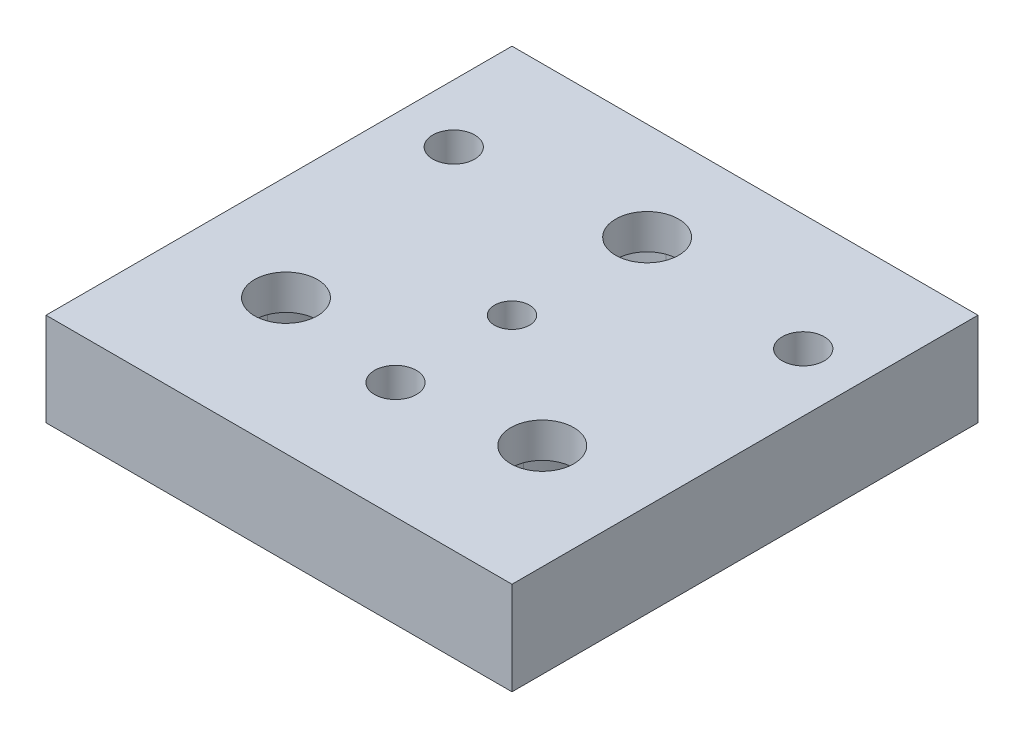
ISO-10303-21;
HEADER;
FILE_DESCRIPTION(('STEP AP214'),'2;1');
FILE_NAME('part.step','',(''),(''),'','','');
FILE_SCHEMA(('AUTOMOTIVE_DESIGN { 1 0 10303 214 1 1 1 1 }'));
ENDSEC;
DATA;
#1=APPLICATION_CONTEXT('core data for automotive mechanical design processes');
#2=APPLICATION_PROTOCOL_DEFINITION('international standard','automotive_design',2000,#1);
#3=PRODUCT_CONTEXT('',#1,'mechanical');
#4=PRODUCT('Part','Part','',(#3));
#5=PRODUCT_RELATED_PRODUCT_CATEGORY('part','',(#4));
#6=PRODUCT_DEFINITION_FORMATION('','',#4);
#7=PRODUCT_DEFINITION_CONTEXT('part definition',#1,'design');
#8=PRODUCT_DEFINITION('design','',#6,#7);
#9=PRODUCT_DEFINITION_SHAPE('','',#8);
#10=(LENGTH_UNIT() NAMED_UNIT(*) SI_UNIT(.MILLI.,.METRE.));
#11=(NAMED_UNIT(*) PLANE_ANGLE_UNIT() SI_UNIT($,.RADIAN.));
#12=(NAMED_UNIT(*) SI_UNIT($,.STERADIAN.) SOLID_ANGLE_UNIT());
#13=UNCERTAINTY_MEASURE_WITH_UNIT(LENGTH_MEASURE(1.E-05),#10,'distance_accuracy_value','');
#14=(GEOMETRIC_REPRESENTATION_CONTEXT(3) GLOBAL_UNCERTAINTY_ASSIGNED_CONTEXT((#13)) GLOBAL_UNIT_ASSIGNED_CONTEXT((#10,
#11,#12)) REPRESENTATION_CONTEXT('',''));
#15=CARTESIAN_POINT('',(0.,0.,0.));
#16=DIRECTION('',(0.,0.,1.));
#17=DIRECTION('',(1.,0.,0.));
#18=AXIS2_PLACEMENT_3D('',#15,#16,#17);
#19=CARTESIAN_POINT('',(25.4,10.16,-25.4));
#20=DIRECTION('',(-1.,0.,0.));
#21=DIRECTION('',(0.,0.,1.));
#22=AXIS2_PLACEMENT_3D('',#19,#20,#21);
#23=PLANE('',#22);
#24=DIRECTION('',(0.,0.,-1.));
#25=VECTOR('',#24,1.);
#26=CARTESIAN_POINT('',(25.4,0.,-25.4));
#27=LINE('',#26,#25);
#28=CARTESIAN_POINT('',(25.4,0.,25.4));
#29=VERTEX_POINT('',#28);
#30=CARTESIAN_POINT('',(25.4,0.,-25.4));
#31=VERTEX_POINT('',#30);
#32=EDGE_CURVE('E264',#29,#31,#27,.T.);
#33=ORIENTED_EDGE('',*,*,#32,.T.);
#34=DIRECTION('',(0.,-1.,0.));
#35=VECTOR('',#34,1.);
#36=CARTESIAN_POINT('',(25.4,10.16,-25.4));
#37=LINE('',#36,#35);
#38=CARTESIAN_POINT('',(25.4,10.16,-25.4));
#39=VERTEX_POINT('',#38);
#40=EDGE_CURVE('E11',#39,#31,#37,.T.);
#41=ORIENTED_EDGE('',*,*,#40,.F.);
#42=DIRECTION('',(0.,0.,-1.));
#43=VECTOR('',#42,1.);
#44=CARTESIAN_POINT('',(25.4,10.16,-25.4));
#45=LINE('',#44,#43);
#46=CARTESIAN_POINT('',(25.4,10.16,25.4));
#47=VERTEX_POINT('',#46);
#48=EDGE_CURVE('E267',#47,#39,#45,.T.);
#49=ORIENTED_EDGE('',*,*,#48,.F.);
#50=DIRECTION('',(0.,-1.,0.));
#51=VECTOR('',#50,1.);
#52=CARTESIAN_POINT('',(25.4,10.16,25.4));
#53=LINE('',#52,#51);
#54=EDGE_CURVE('E277',#47,#29,#53,.T.);
#55=ORIENTED_EDGE('',*,*,#54,.T.);
#56=EDGE_LOOP('',(#33,#41,#49,#55));
#57=FACE_BOUND('',#56,.T.);
#58=ADVANCED_FACE('F33',(#57),#23,.F.);
#59=CARTESIAN_POINT('',(-25.4,10.16,-25.4));
#60=DIRECTION('',(0.,0.,1.));
#61=DIRECTION('',(1.,0.,0.));
#62=AXIS2_PLACEMENT_3D('',#59,#60,#61);
#63=PLANE('',#62);
#64=DIRECTION('',(-1.,0.,0.));
#65=VECTOR('',#64,1.);
#66=CARTESIAN_POINT('',(-25.4,0.,-25.4));
#67=LINE('',#66,#65);
#68=CARTESIAN_POINT('',(-25.4,0.,-25.4));
#69=VERTEX_POINT('',#68);
#70=EDGE_CURVE('E280',#31,#69,#67,.T.);
#71=ORIENTED_EDGE('',*,*,#70,.T.);
#72=DIRECTION('',(0.,-1.,0.));
#73=VECTOR('',#72,1.);
#74=CARTESIAN_POINT('',(-25.4,10.16,-25.4));
#75=LINE('',#74,#73);
#76=CARTESIAN_POINT('',(-25.4,10.16,-25.4));
#77=VERTEX_POINT('',#76);
#78=EDGE_CURVE('E40',#77,#69,#75,.T.);
#79=ORIENTED_EDGE('',*,*,#78,.F.);
#80=DIRECTION('',(-1.,0.,0.));
#81=VECTOR('',#80,1.);
#82=CARTESIAN_POINT('',(-25.4,10.16,-25.4));
#83=LINE('',#82,#81);
#84=EDGE_CURVE('E270',#39,#77,#83,.T.);
#85=ORIENTED_EDGE('',*,*,#84,.F.);
#86=ORIENTED_EDGE('',*,*,#40,.T.);
#87=EDGE_LOOP('',(#71,#79,#85,#86));
#88=FACE_BOUND('',#87,.T.);
#89=ADVANCED_FACE('F310',(#88),#63,.F.);
#90=CARTESIAN_POINT('',(-25.4,10.16,-25.4));
#91=DIRECTION('',(1.,0.,0.));
#92=DIRECTION('',(0.,0.,-1.));
#93=AXIS2_PLACEMENT_3D('',#90,#91,#92);
#94=PLANE('',#93);
#95=DIRECTION('',(0.,0.,1.));
#96=VECTOR('',#95,1.);
#97=CARTESIAN_POINT('',(-25.4,0.,-25.4));
#98=LINE('',#97,#96);
#99=CARTESIAN_POINT('',(-25.4,0.,25.4));
#100=VERTEX_POINT('',#99);
#101=EDGE_CURVE('E282',#69,#100,#98,.T.);
#102=ORIENTED_EDGE('',*,*,#101,.T.);
#103=DIRECTION('',(0.,-1.,0.));
#104=VECTOR('',#103,1.);
#105=CARTESIAN_POINT('',(-25.4,10.16,25.4));
#106=LINE('',#105,#104);
#107=CARTESIAN_POINT('',(-25.4,10.16,25.4));
#108=VERTEX_POINT('',#107);
#109=EDGE_CURVE('E287',#108,#100,#106,.T.);
#110=ORIENTED_EDGE('',*,*,#109,.F.);
#111=DIRECTION('',(0.,0.,1.));
#112=VECTOR('',#111,1.);
#113=CARTESIAN_POINT('',(-25.4,10.16,-25.4));
#114=LINE('',#113,#112);
#115=EDGE_CURVE('E273',#77,#108,#114,.T.);
#116=ORIENTED_EDGE('',*,*,#115,.F.);
#117=ORIENTED_EDGE('',*,*,#78,.T.);
#118=EDGE_LOOP('',(#102,#110,#116,#117));
#119=FACE_BOUND('',#118,.T.);
#120=ADVANCED_FACE('F294',(#119),#94,.F.);
#121=CARTESIAN_POINT('',(-25.4,10.16,25.4));
#122=DIRECTION('',(0.,0.,-1.));
#123=DIRECTION('',(-1.,0.,0.));
#124=AXIS2_PLACEMENT_3D('',#121,#122,#123);
#125=PLANE('',#124);
#126=DIRECTION('',(1.,0.,0.));
#127=VECTOR('',#126,1.);
#128=CARTESIAN_POINT('',(-25.4,0.,25.4));
#129=LINE('',#128,#127);
#130=EDGE_CURVE('E271',#100,#29,#129,.T.);
#131=ORIENTED_EDGE('',*,*,#130,.T.);
#132=ORIENTED_EDGE('',*,*,#54,.F.);
#133=DIRECTION('',(1.,0.,0.));
#134=VECTOR('',#133,1.);
#135=CARTESIAN_POINT('',(-25.4,10.16,25.4));
#136=LINE('',#135,#134);
#137=EDGE_CURVE('E275',#108,#47,#136,.T.);
#138=ORIENTED_EDGE('',*,*,#137,.F.);
#139=ORIENTED_EDGE('',*,*,#109,.T.);
#140=EDGE_LOOP('',(#131,#132,#138,#139));
#141=FACE_BOUND('',#140,.T.);
#142=ADVANCED_FACE('F303',(#141),#125,.F.);
#143=CARTESIAN_POINT('',(0.,10.16,0.));
#144=DIRECTION('',(0.,1.,0.));
#145=DIRECTION('',(0.,0.,1.));
#146=AXIS2_PLACEMENT_3D('',#143,#144,#145);
#147=PLANE('',#146);
#148=CARTESIAN_POINT('',(0.,10.16,0.));
#149=DIRECTION('',(0.,1.,0.));
#150=DIRECTION('',(0.,0.,1.));
#151=AXIS2_PLACEMENT_3D('',#148,#149,#150);
#152=CIRCLE('',#151,1.905);
#153=CARTESIAN_POINT('',(0.,10.16,1.905));
#154=VERTEX_POINT('',#153);
#155=EDGE_CURVE('E415',#154,#154,#152,.T.);
#156=ORIENTED_EDGE('',*,*,#155,.F.);
#157=EDGE_LOOP('',(#156));
#158=FACE_BOUND('',#157,.T.);
#159=CARTESIAN_POINT('',(0.,10.16,-14.732));
#160=DIRECTION('',(0.,-1.,0.));
#161=DIRECTION('',(0.,0.,-1.));
#162=AXIS2_PLACEMENT_3D('',#159,#160,#161);
#163=CIRCLE('',#162,3.429);
#164=CARTESIAN_POINT('',(0.,10.16,-18.161));
#165=VERTEX_POINT('',#164);
#166=EDGE_CURVE('E417',#165,#165,#163,.T.);
#167=ORIENTED_EDGE('',*,*,#166,.T.);
#168=EDGE_LOOP('',(#167));
#169=FACE_BOUND('',#168,.T.);
#170=CARTESIAN_POINT('',(13.97,10.16,10.668));
#171=DIRECTION('',(0.,-1.,0.));
#172=DIRECTION('',(0.,0.,-1.));
#173=AXIS2_PLACEMENT_3D('',#170,#171,#172);
#174=CIRCLE('',#173,3.429);
#175=CARTESIAN_POINT('',(13.97,10.16,7.23899999999999));
#176=VERTEX_POINT('',#175);
#177=EDGE_CURVE('E425',#176,#176,#174,.T.);
#178=ORIENTED_EDGE('',*,*,#177,.T.);
#179=EDGE_LOOP('',(#178));
#180=FACE_BOUND('',#179,.T.);
#181=CARTESIAN_POINT('',(-13.97,10.16,10.668));
#182=DIRECTION('',(0.,-1.,0.));
#183=DIRECTION('',(0.,0.,-1.));
#184=AXIS2_PLACEMENT_3D('',#181,#182,#183);
#185=CIRCLE('',#184,3.429);
#186=CARTESIAN_POINT('',(-13.97,10.16,7.239));
#187=VERTEX_POINT('',#186);
#188=EDGE_CURVE('E430',#187,#187,#185,.T.);
#189=ORIENTED_EDGE('',*,*,#188,.T.);
#190=EDGE_LOOP('',(#189));
#191=FACE_BOUND('',#190,.T.);
#192=CARTESIAN_POINT('',(0.,10.16,12.7));
#193=DIRECTION('',(0.,1.,0.));
#194=DIRECTION('',(0.,0.,1.));
#195=AXIS2_PLACEMENT_3D('',#192,#193,#194);
#196=CIRCLE('',#195,2.286);
#197=CARTESIAN_POINT('',(0.,10.16,14.986));
#198=VERTEX_POINT('',#197);
#199=EDGE_CURVE('E242',#198,#198,#196,.T.);
#200=ORIENTED_EDGE('',*,*,#199,.F.);
#201=EDGE_LOOP('',(#200));
#202=FACE_BOUND('',#201,.T.);
#203=CARTESIAN_POINT('',(19.05,10.16,-12.7));
#204=DIRECTION('',(0.,1.,0.));
#205=DIRECTION('',(0.,0.,1.));
#206=AXIS2_PLACEMENT_3D('',#203,#204,#205);
#207=CIRCLE('',#206,2.286);
#208=CARTESIAN_POINT('',(19.05,10.16,-10.414));
#209=VERTEX_POINT('',#208);
#210=EDGE_CURVE('E252',#209,#209,#207,.T.);
#211=ORIENTED_EDGE('',*,*,#210,.F.);
#212=EDGE_LOOP('',(#211));
#213=FACE_BOUND('',#212,.T.);
#214=CARTESIAN_POINT('',(-19.05,10.16,-12.7));
#215=DIRECTION('',(0.,1.,0.));
#216=DIRECTION('',(0.,0.,1.));
#217=AXIS2_PLACEMENT_3D('',#214,#215,#216);
#218=CIRCLE('',#217,2.286);
#219=CARTESIAN_POINT('',(-19.05,10.16,-10.414));
#220=VERTEX_POINT('',#219);
#221=EDGE_CURVE('E258',#220,#220,#218,.T.);
#222=ORIENTED_EDGE('',*,*,#221,.F.);
#223=EDGE_LOOP('',(#222));
#224=FACE_BOUND('',#223,.T.);
#225=ORIENTED_EDGE('',*,*,#48,.T.);
#226=ORIENTED_EDGE('',*,*,#84,.T.);
#227=ORIENTED_EDGE('',*,*,#115,.T.);
#228=ORIENTED_EDGE('',*,*,#137,.T.);
#229=EDGE_LOOP('',(#225,#226,#227,#228));
#230=FACE_BOUND('',#229,.T.);
#231=ADVANCED_FACE('F309',(#158,#169,#180,#191,#202,#213,#224,#230),#147,.T.);
#232=CARTESIAN_POINT('',(0.,0.,0.));
#233=DIRECTION('',(0.,1.,0.));
#234=DIRECTION('',(0.,0.,1.));
#235=AXIS2_PLACEMENT_3D('',#232,#233,#234);
#236=PLANE('',#235);
#237=CARTESIAN_POINT('',(0.,0.,0.));
#238=DIRECTION('',(0.,1.,0.));
#239=DIRECTION('',(0.,0.,1.));
#240=AXIS2_PLACEMENT_3D('',#237,#238,#239);
#241=CIRCLE('',#240,1.905);
#242=CARTESIAN_POINT('',(0.,0.,1.905));
#243=VERTEX_POINT('',#242);
#244=EDGE_CURVE('E412',#243,#243,#241,.T.);
#245=ORIENTED_EDGE('',*,*,#244,.T.);
#246=EDGE_LOOP('',(#245));
#247=FACE_BOUND('',#246,.T.);
#248=DIRECTION('',(1.,0.,0.));
#249=VECTOR('',#248,1.);
#250=CARTESIAN_POINT('',(-5.58800000000001,0.,-22.352));
#251=LINE('',#250,#249);
#252=CARTESIAN_POINT('',(-5.58800000000001,0.,-22.352));
#253=VERTEX_POINT('',#252);
#254=CARTESIAN_POINT('',(5.588,0.,-22.352));
#255=VERTEX_POINT('',#254);
#256=EDGE_CURVE('E177',#253,#255,#251,.T.);
#257=ORIENTED_EDGE('',*,*,#256,.F.);
#258=CARTESIAN_POINT('',(-5.58800000000001,0.,-14.732));
#259=DIRECTION('',(0.,-1.,0.));
#260=DIRECTION('',(0.,0.,-1.));
#261=AXIS2_PLACEMENT_3D('',#258,#259,#260);
#262=CIRCLE('',#261,7.62);
#263=CARTESIAN_POINT('',(-5.58800000000001,0.,-7.112));
#264=VERTEX_POINT('',#263);
#265=EDGE_CURVE('E47',#264,#253,#262,.T.);
#266=ORIENTED_EDGE('',*,*,#265,.F.);
#267=DIRECTION('',(-1.,0.,0.));
#268=VECTOR('',#267,1.);
#269=CARTESIAN_POINT('',(-5.58800000000001,0.,-7.112));
#270=LINE('',#269,#268);
#271=CARTESIAN_POINT('',(5.58799999999999,0.,-7.112));
#272=VERTEX_POINT('',#271);
#273=EDGE_CURVE('E165',#272,#264,#270,.T.);
#274=ORIENTED_EDGE('',*,*,#273,.F.);
#275=CARTESIAN_POINT('',(5.58799999999999,0.,-14.732));
#276=DIRECTION('',(0.,-1.,0.));
#277=DIRECTION('',(0.,0.,-1.));
#278=AXIS2_PLACEMENT_3D('',#275,#276,#277);
#279=CIRCLE('',#278,7.62);
#280=EDGE_CURVE('E168',#255,#272,#279,.T.);
#281=ORIENTED_EDGE('',*,*,#280,.F.);
#282=EDGE_LOOP('',(#257,#266,#274,#281));
#283=FACE_BOUND('',#282,.T.);
#284=DIRECTION('',(0.,0.,-1.));
#285=VECTOR('',#284,1.);
#286=CARTESIAN_POINT('',(6.34999999999999,0.,16.256));
#287=LINE('',#286,#285);
#288=CARTESIAN_POINT('',(6.34999999999999,0.,16.256));
#289=VERTEX_POINT('',#288);
#290=CARTESIAN_POINT('',(6.34999999999999,0.,5.08));
#291=VERTEX_POINT('',#290);
#292=EDGE_CURVE('E201',#289,#291,#287,.T.);
#293=ORIENTED_EDGE('',*,*,#292,.F.);
#294=CARTESIAN_POINT('',(13.97,0.,16.256));
#295=DIRECTION('',(0.,-1.,0.));
#296=DIRECTION('',(0.,0.,-1.));
#297=AXIS2_PLACEMENT_3D('',#294,#295,#296);
#298=CIRCLE('',#297,7.62);
#299=CARTESIAN_POINT('',(21.59,0.,16.256));
#300=VERTEX_POINT('',#299);
#301=EDGE_CURVE('E55',#300,#289,#298,.T.);
#302=ORIENTED_EDGE('',*,*,#301,.F.);
#303=DIRECTION('',(0.,0.,1.));
#304=VECTOR('',#303,1.);
#305=CARTESIAN_POINT('',(21.59,0.,16.256));
#306=LINE('',#305,#304);
#307=CARTESIAN_POINT('',(21.59,0.,5.08));
#308=VERTEX_POINT('',#307);
#309=EDGE_CURVE('E190',#308,#300,#306,.T.);
#310=ORIENTED_EDGE('',*,*,#309,.F.);
#311=CARTESIAN_POINT('',(13.97,0.,5.08));
#312=DIRECTION('',(0.,-1.,0.));
#313=DIRECTION('',(0.,0.,-1.));
#314=AXIS2_PLACEMENT_3D('',#311,#312,#313);
#315=CIRCLE('',#314,7.62);
#316=EDGE_CURVE('E204',#291,#308,#315,.T.);
#317=ORIENTED_EDGE('',*,*,#316,.F.);
#318=EDGE_LOOP('',(#293,#302,#310,#317));
#319=FACE_BOUND('',#318,.T.);
#320=DIRECTION('',(0.,0.,-1.));
#321=VECTOR('',#320,1.);
#322=CARTESIAN_POINT('',(-21.59,0.,16.256));
#323=LINE('',#322,#321);
#324=CARTESIAN_POINT('',(-21.59,0.,16.256));
#325=VERTEX_POINT('',#324);
#326=CARTESIAN_POINT('',(-21.59,0.,5.08));
#327=VERTEX_POINT('',#326);
#328=EDGE_CURVE('E232',#325,#327,#323,.T.);
#329=ORIENTED_EDGE('',*,*,#328,.F.);
#330=CARTESIAN_POINT('',(-13.97,0.,16.256));
#331=DIRECTION('',(0.,-1.,0.));
#332=DIRECTION('',(0.,0.,-1.));
#333=AXIS2_PLACEMENT_3D('',#330,#331,#332);
#334=CIRCLE('',#333,7.62);
#335=CARTESIAN_POINT('',(-6.35000000000004,0.,16.256));
#336=VERTEX_POINT('',#335);
#337=EDGE_CURVE('E211',#336,#325,#334,.T.);
#338=ORIENTED_EDGE('',*,*,#337,.F.);
#339=DIRECTION('',(0.,0.,1.));
#340=VECTOR('',#339,1.);
#341=CARTESIAN_POINT('',(-6.35000000000004,0.,16.256));
#342=LINE('',#341,#340);
#343=CARTESIAN_POINT('',(-6.35000000000003,0.,5.08));
#344=VERTEX_POINT('',#343);
#345=EDGE_CURVE('E221',#344,#336,#342,.T.);
#346=ORIENTED_EDGE('',*,*,#345,.F.);
#347=CARTESIAN_POINT('',(-13.97,0.,5.08));
#348=DIRECTION('',(0.,-1.,0.));
#349=DIRECTION('',(0.,0.,-1.));
#350=AXIS2_PLACEMENT_3D('',#347,#348,#349);
#351=CIRCLE('',#350,7.62);
#352=EDGE_CURVE('E235',#327,#344,#351,.T.);
#353=ORIENTED_EDGE('',*,*,#352,.F.);
#354=EDGE_LOOP('',(#329,#338,#346,#353));
#355=FACE_BOUND('',#354,.T.);
#356=CARTESIAN_POINT('',(0.,0.,12.7));
#357=DIRECTION('',(0.,1.,0.));
#358=DIRECTION('',(0.,0.,1.));
#359=AXIS2_PLACEMENT_3D('',#356,#357,#358);
#360=CIRCLE('',#359,2.286);
#361=CARTESIAN_POINT('',(0.,0.,14.986));
#362=VERTEX_POINT('',#361);
#363=EDGE_CURVE('E249',#362,#362,#360,.T.);
#364=ORIENTED_EDGE('',*,*,#363,.T.);
#365=EDGE_LOOP('',(#364));
#366=FACE_BOUND('',#365,.T.);
#367=CARTESIAN_POINT('',(19.05,0.,-12.7));
#368=DIRECTION('',(0.,1.,0.));
#369=DIRECTION('',(0.,0.,1.));
#370=AXIS2_PLACEMENT_3D('',#367,#368,#369);
#371=CIRCLE('',#370,2.286);
#372=CARTESIAN_POINT('',(19.05,0.,-10.414));
#373=VERTEX_POINT('',#372);
#374=EDGE_CURVE('E255',#373,#373,#371,.T.);
#375=ORIENTED_EDGE('',*,*,#374,.T.);
#376=EDGE_LOOP('',(#375));
#377=FACE_BOUND('',#376,.T.);
#378=CARTESIAN_POINT('',(-19.05,0.,-12.7));
#379=DIRECTION('',(0.,1.,0.));
#380=DIRECTION('',(0.,0.,1.));
#381=AXIS2_PLACEMENT_3D('',#378,#379,#380);
#382=CIRCLE('',#381,2.286);
#383=CARTESIAN_POINT('',(-19.05,0.,-10.414));
#384=VERTEX_POINT('',#383);
#385=EDGE_CURVE('E261',#384,#384,#382,.T.);
#386=ORIENTED_EDGE('',*,*,#385,.T.);
#387=EDGE_LOOP('',(#386));
#388=FACE_BOUND('',#387,.T.);
#389=ORIENTED_EDGE('',*,*,#32,.F.);
#390=ORIENTED_EDGE('',*,*,#130,.F.);
#391=ORIENTED_EDGE('',*,*,#101,.F.);
#392=ORIENTED_EDGE('',*,*,#70,.F.);
#393=EDGE_LOOP('',(#389,#390,#391,#392));
#394=FACE_BOUND('',#393,.T.);
#395=ADVANCED_FACE('F300',(#247,#283,#319,#355,#366,#377,#388,#394),#236,.F.);
#396=CARTESIAN_POINT('',(-19.05,0.,-12.7));
#397=DIRECTION('',(0.,1.,0.));
#398=DIRECTION('',(0.,0.,1.));
#399=AXIS2_PLACEMENT_3D('',#396,#397,#398);
#400=CYLINDRICAL_SURFACE('',#399,2.286);
#401=ORIENTED_EDGE('',*,*,#385,.F.);
#402=EDGE_LOOP('',(#401));
#403=FACE_BOUND('',#402,.T.);
#404=ORIENTED_EDGE('',*,*,#221,.T.);
#405=EDGE_LOOP('',(#404));
#406=FACE_BOUND('',#405,.T.);
#407=ADVANCED_FACE('F322',(#403,#406),#400,.F.);
#408=CARTESIAN_POINT('',(19.05,0.,-12.7));
#409=DIRECTION('',(0.,1.,0.));
#410=DIRECTION('',(0.,0.,1.));
#411=AXIS2_PLACEMENT_3D('',#408,#409,#410);
#412=CYLINDRICAL_SURFACE('',#411,2.286);
#413=ORIENTED_EDGE('',*,*,#374,.F.);
#414=EDGE_LOOP('',(#413));
#415=FACE_BOUND('',#414,.T.);
#416=ORIENTED_EDGE('',*,*,#210,.T.);
#417=EDGE_LOOP('',(#416));
#418=FACE_BOUND('',#417,.T.);
#419=ADVANCED_FACE('F329',(#415,#418),#412,.F.);
#420=CARTESIAN_POINT('',(0.,0.,12.7));
#421=DIRECTION('',(0.,1.,0.));
#422=DIRECTION('',(0.,0.,1.));
#423=AXIS2_PLACEMENT_3D('',#420,#421,#422);
#424=CYLINDRICAL_SURFACE('',#423,2.286);
#425=ORIENTED_EDGE('',*,*,#363,.F.);
#426=EDGE_LOOP('',(#425));
#427=FACE_BOUND('',#426,.T.);
#428=ORIENTED_EDGE('',*,*,#199,.T.);
#429=EDGE_LOOP('',(#428));
#430=FACE_BOUND('',#429,.T.);
#431=ADVANCED_FACE('F333',(#427,#430),#424,.F.);
#432=CARTESIAN_POINT('',(-13.97,6.35,16.256));
#433=DIRECTION('',(0.,-1.,0.));
#434=DIRECTION('',(0.,0.,-1.));
#435=AXIS2_PLACEMENT_3D('',#432,#433,#434);
#436=CYLINDRICAL_SURFACE('',#435,7.62);
#437=ORIENTED_EDGE('',*,*,#337,.T.);
#438=DIRECTION('',(0.,-1.,0.));
#439=VECTOR('',#438,1.);
#440=CARTESIAN_POINT('',(-21.59,6.35,16.256));
#441=LINE('',#440,#439);
#442=CARTESIAN_POINT('',(-21.59,6.35,16.256));
#443=VERTEX_POINT('',#442);
#444=EDGE_CURVE('E230',#443,#325,#441,.T.);
#445=ORIENTED_EDGE('',*,*,#444,.F.);
#446=CARTESIAN_POINT('',(-13.97,6.35,16.256));
#447=DIRECTION('',(0.,-1.,0.));
#448=DIRECTION('',(0.,0.,-1.));
#449=AXIS2_PLACEMENT_3D('',#446,#447,#448);
#450=CIRCLE('',#449,7.62);
#451=CARTESIAN_POINT('',(-6.35000000000004,6.35,16.256));
#452=VERTEX_POINT('',#451);
#453=EDGE_CURVE('E217',#452,#443,#450,.T.);
#454=ORIENTED_EDGE('',*,*,#453,.F.);
#455=DIRECTION('',(0.,-1.,0.));
#456=VECTOR('',#455,1.);
#457=CARTESIAN_POINT('',(-6.35000000000004,6.35,16.256));
#458=LINE('',#457,#456);
#459=EDGE_CURVE('E240',#452,#336,#458,.T.);
#460=ORIENTED_EDGE('',*,*,#459,.T.);
#461=EDGE_LOOP('',(#437,#445,#454,#460));
#462=FACE_BOUND('',#461,.T.);
#463=ADVANCED_FACE('F337',(#462),#436,.F.);
#464=CARTESIAN_POINT('',(-6.35000000000004,6.35,16.256));
#465=DIRECTION('',(1.,0.,0.));
#466=DIRECTION('',(0.,0.,-1.));
#467=AXIS2_PLACEMENT_3D('',#464,#465,#466);
#468=PLANE('',#467);
#469=ORIENTED_EDGE('',*,*,#345,.T.);
#470=ORIENTED_EDGE('',*,*,#459,.F.);
#471=DIRECTION('',(0.,0.,1.));
#472=VECTOR('',#471,1.);
#473=CARTESIAN_POINT('',(-6.35000000000004,6.35,16.256));
#474=LINE('',#473,#472);
#475=CARTESIAN_POINT('',(-6.35000000000003,6.35,5.08));
#476=VERTEX_POINT('',#475);
#477=EDGE_CURVE('E227',#476,#452,#474,.T.);
#478=ORIENTED_EDGE('',*,*,#477,.F.);
#479=DIRECTION('',(0.,-1.,0.));
#480=VECTOR('',#479,1.);
#481=CARTESIAN_POINT('',(-6.35000000000003,6.35,5.08));
#482=LINE('',#481,#480);
#483=EDGE_CURVE('E243',#476,#344,#482,.T.);
#484=ORIENTED_EDGE('',*,*,#483,.T.);
#485=EDGE_LOOP('',(#469,#470,#478,#484));
#486=FACE_BOUND('',#485,.T.);
#487=ADVANCED_FACE('F341',(#486),#468,.F.);
#488=CARTESIAN_POINT('',(-13.97,6.35,5.08));
#489=DIRECTION('',(0.,-1.,0.));
#490=DIRECTION('',(0.,0.,-1.));
#491=AXIS2_PLACEMENT_3D('',#488,#489,#490);
#492=CYLINDRICAL_SURFACE('',#491,7.62);
#493=ORIENTED_EDGE('',*,*,#352,.T.);
#494=ORIENTED_EDGE('',*,*,#483,.F.);
#495=CARTESIAN_POINT('',(-13.97,6.35,5.08));
#496=DIRECTION('',(0.,-1.,0.));
#497=DIRECTION('',(0.,0.,-1.));
#498=AXIS2_PLACEMENT_3D('',#495,#496,#497);
#499=CIRCLE('',#498,7.62);
#500=CARTESIAN_POINT('',(-21.59,6.35,5.08));
#501=VERTEX_POINT('',#500);
#502=EDGE_CURVE('E224',#501,#476,#499,.T.);
#503=ORIENTED_EDGE('',*,*,#502,.F.);
#504=DIRECTION('',(0.,-1.,0.));
#505=VECTOR('',#504,1.);
#506=CARTESIAN_POINT('',(-21.59,6.35,5.08));
#507=LINE('',#506,#505);
#508=EDGE_CURVE('E245',#501,#327,#507,.T.);
#509=ORIENTED_EDGE('',*,*,#508,.T.);
#510=EDGE_LOOP('',(#493,#494,#503,#509));
#511=FACE_BOUND('',#510,.T.);
#512=ADVANCED_FACE('F347',(#511),#492,.F.);
#513=CARTESIAN_POINT('',(-21.59,6.35,16.256));
#514=DIRECTION('',(-1.,0.,0.));
#515=DIRECTION('',(0.,0.,1.));
#516=AXIS2_PLACEMENT_3D('',#513,#514,#515);
#517=PLANE('',#516);
#518=ORIENTED_EDGE('',*,*,#328,.T.);
#519=ORIENTED_EDGE('',*,*,#508,.F.);
#520=DIRECTION('',(0.,0.,-1.));
#521=VECTOR('',#520,1.);
#522=CARTESIAN_POINT('',(-21.59,6.35,16.256));
#523=LINE('',#522,#521);
#524=EDGE_CURVE('E220',#443,#501,#523,.T.);
#525=ORIENTED_EDGE('',*,*,#524,.F.);
#526=ORIENTED_EDGE('',*,*,#444,.T.);
#527=EDGE_LOOP('',(#518,#519,#525,#526));
#528=FACE_BOUND('',#527,.T.);
#529=ADVANCED_FACE('F343',(#528),#517,.F.);
#530=CARTESIAN_POINT('',(-13.97,6.35,16.256));
#531=DIRECTION('',(0.,-1.,0.));
#532=DIRECTION('',(0.,0.,-1.));
#533=AXIS2_PLACEMENT_3D('',#530,#531,#532);
#534=PLANE('',#533);
#535=CARTESIAN_POINT('',(-13.97,6.35,10.668));
#536=DIRECTION('',(0.,-1.,0.));
#537=DIRECTION('',(0.,0.,-1.));
#538=AXIS2_PLACEMENT_3D('',#535,#536,#537);
#539=CIRCLE('',#538,3.429);
#540=CARTESIAN_POINT('',(-13.97,6.35,7.239));
#541=VERTEX_POINT('',#540);
#542=EDGE_CURVE('E171',#541,#541,#539,.T.);
#543=ORIENTED_EDGE('',*,*,#542,.F.);
#544=EDGE_LOOP('',(#543));
#545=FACE_BOUND('',#544,.T.);
#546=ORIENTED_EDGE('',*,*,#453,.T.);
#547=ORIENTED_EDGE('',*,*,#524,.T.);
#548=ORIENTED_EDGE('',*,*,#502,.T.);
#549=ORIENTED_EDGE('',*,*,#477,.T.);
#550=EDGE_LOOP('',(#546,#547,#548,#549));
#551=FACE_BOUND('',#550,.T.);
#552=ADVANCED_FACE('F346',(#545,#551),#534,.T.);
#553=CARTESIAN_POINT('',(13.97,6.35,16.256));
#554=DIRECTION('',(0.,-1.,0.));
#555=DIRECTION('',(0.,0.,-1.));
#556=AXIS2_PLACEMENT_3D('',#553,#554,#555);
#557=CYLINDRICAL_SURFACE('',#556,7.62);
#558=ORIENTED_EDGE('',*,*,#301,.T.);
#559=DIRECTION('',(0.,-1.,0.));
#560=VECTOR('',#559,1.);
#561=CARTESIAN_POINT('',(6.34999999999999,6.35,16.256));
#562=LINE('',#561,#560);
#563=CARTESIAN_POINT('',(6.34999999999999,6.35,16.256));
#564=VERTEX_POINT('',#563);
#565=EDGE_CURVE('E199',#564,#289,#562,.T.);
#566=ORIENTED_EDGE('',*,*,#565,.F.);
#567=CARTESIAN_POINT('',(13.97,6.35,16.256));
#568=DIRECTION('',(0.,-1.,0.));
#569=DIRECTION('',(0.,0.,-1.));
#570=AXIS2_PLACEMENT_3D('',#567,#568,#569);
#571=CIRCLE('',#570,7.62);
#572=CARTESIAN_POINT('',(21.59,6.35,16.256));
#573=VERTEX_POINT('',#572);
#574=EDGE_CURVE('E186',#573,#564,#571,.T.);
#575=ORIENTED_EDGE('',*,*,#574,.F.);
#576=DIRECTION('',(0.,-1.,0.));
#577=VECTOR('',#576,1.);
#578=CARTESIAN_POINT('',(21.59,6.35,16.256));
#579=LINE('',#578,#577);
#580=EDGE_CURVE('E209',#573,#300,#579,.T.);
#581=ORIENTED_EDGE('',*,*,#580,.T.);
#582=EDGE_LOOP('',(#558,#566,#575,#581));
#583=FACE_BOUND('',#582,.T.);
#584=ADVANCED_FACE('F357',(#583),#557,.F.);
#585=CARTESIAN_POINT('',(21.59,6.35,16.256));
#586=DIRECTION('',(1.,0.,0.));
#587=DIRECTION('',(0.,0.,-1.));
#588=AXIS2_PLACEMENT_3D('',#585,#586,#587);
#589=PLANE('',#588);
#590=ORIENTED_EDGE('',*,*,#309,.T.);
#591=ORIENTED_EDGE('',*,*,#580,.F.);
#592=DIRECTION('',(0.,0.,1.));
#593=VECTOR('',#592,1.);
#594=CARTESIAN_POINT('',(21.59,6.35,16.256));
#595=LINE('',#594,#593);
#596=CARTESIAN_POINT('',(21.59,6.35,5.08));
#597=VERTEX_POINT('',#596);
#598=EDGE_CURVE('E196',#597,#573,#595,.T.);
#599=ORIENTED_EDGE('',*,*,#598,.F.);
#600=DIRECTION('',(0.,-1.,0.));
#601=VECTOR('',#600,1.);
#602=CARTESIAN_POINT('',(21.59,6.35,5.08));
#603=LINE('',#602,#601);
#604=EDGE_CURVE('E212',#597,#308,#603,.T.);
#605=ORIENTED_EDGE('',*,*,#604,.T.);
#606=EDGE_LOOP('',(#590,#591,#599,#605));
#607=FACE_BOUND('',#606,.T.);
#608=ADVANCED_FACE('F361',(#607),#589,.F.);
#609=CARTESIAN_POINT('',(13.97,6.35,5.08));
#610=DIRECTION('',(0.,-1.,0.));
#611=DIRECTION('',(0.,0.,-1.));
#612=AXIS2_PLACEMENT_3D('',#609,#610,#611);
#613=CYLINDRICAL_SURFACE('',#612,7.62);
#614=ORIENTED_EDGE('',*,*,#316,.T.);
#615=ORIENTED_EDGE('',*,*,#604,.F.);
#616=CARTESIAN_POINT('',(13.97,6.35,5.08));
#617=DIRECTION('',(0.,-1.,0.));
#618=DIRECTION('',(0.,0.,-1.));
#619=AXIS2_PLACEMENT_3D('',#616,#617,#618);
#620=CIRCLE('',#619,7.62);
#621=CARTESIAN_POINT('',(6.34999999999999,6.35,5.08));
#622=VERTEX_POINT('',#621);
#623=EDGE_CURVE('E193',#622,#597,#620,.T.);
#624=ORIENTED_EDGE('',*,*,#623,.F.);
#625=DIRECTION('',(0.,-1.,0.));
#626=VECTOR('',#625,1.);
#627=CARTESIAN_POINT('',(6.34999999999999,6.35,5.08));
#628=LINE('',#627,#626);
#629=EDGE_CURVE('E214',#622,#291,#628,.T.);
#630=ORIENTED_EDGE('',*,*,#629,.T.);
#631=EDGE_LOOP('',(#614,#615,#624,#630));
#632=FACE_BOUND('',#631,.T.);
#633=ADVANCED_FACE('F366',(#632),#613,.F.);
#634=CARTESIAN_POINT('',(6.34999999999999,6.35,16.256));
#635=DIRECTION('',(-1.,0.,0.));
#636=DIRECTION('',(0.,0.,1.));
#637=AXIS2_PLACEMENT_3D('',#634,#635,#636);
#638=PLANE('',#637);
#639=ORIENTED_EDGE('',*,*,#292,.T.);
#640=ORIENTED_EDGE('',*,*,#629,.F.);
#641=DIRECTION('',(0.,0.,-1.));
#642=VECTOR('',#641,1.);
#643=CARTESIAN_POINT('',(6.34999999999999,6.35,16.256));
#644=LINE('',#643,#642);
#645=EDGE_CURVE('E189',#564,#622,#644,.T.);
#646=ORIENTED_EDGE('',*,*,#645,.F.);
#647=ORIENTED_EDGE('',*,*,#565,.T.);
#648=EDGE_LOOP('',(#639,#640,#646,#647));
#649=FACE_BOUND('',#648,.T.);
#650=ADVANCED_FACE('F362',(#649),#638,.F.);
#651=CARTESIAN_POINT('',(13.97,6.35,16.256));
#652=DIRECTION('',(0.,-1.,0.));
#653=DIRECTION('',(0.,0.,-1.));
#654=AXIS2_PLACEMENT_3D('',#651,#652,#653);
#655=PLANE('',#654);
#656=CARTESIAN_POINT('',(13.97,6.35,10.668));
#657=DIRECTION('',(0.,-1.,0.));
#658=DIRECTION('',(0.,0.,-1.));
#659=AXIS2_PLACEMENT_3D('',#656,#657,#658);
#660=CIRCLE('',#659,3.429);
#661=CARTESIAN_POINT('',(13.97,6.35,7.23899999999999));
#662=VERTEX_POINT('',#661);
#663=EDGE_CURVE('E428',#662,#662,#660,.T.);
#664=ORIENTED_EDGE('',*,*,#663,.F.);
#665=EDGE_LOOP('',(#664));
#666=FACE_BOUND('',#665,.T.);
#667=ORIENTED_EDGE('',*,*,#574,.T.);
#668=ORIENTED_EDGE('',*,*,#645,.T.);
#669=ORIENTED_EDGE('',*,*,#623,.T.);
#670=ORIENTED_EDGE('',*,*,#598,.T.);
#671=EDGE_LOOP('',(#667,#668,#669,#670));
#672=FACE_BOUND('',#671,.T.);
#673=ADVANCED_FACE('F365',(#666,#672),#655,.T.);
#674=CARTESIAN_POINT('',(-5.58800000000001,6.35,-14.732));
#675=DIRECTION('',(0.,-1.,0.));
#676=DIRECTION('',(0.,0.,-1.));
#677=AXIS2_PLACEMENT_3D('',#674,#675,#676);
#678=CYLINDRICAL_SURFACE('',#677,7.62);
#679=ORIENTED_EDGE('',*,*,#265,.T.);
#680=DIRECTION('',(0.,-1.,0.));
#681=VECTOR('',#680,1.);
#682=CARTESIAN_POINT('',(-5.58800000000001,6.35,-22.352));
#683=LINE('',#682,#681);
#684=CARTESIAN_POINT('',(-5.58800000000001,6.35,-22.352));
#685=VERTEX_POINT('',#684);
#686=EDGE_CURVE('E143',#685,#253,#683,.T.);
#687=ORIENTED_EDGE('',*,*,#686,.F.);
#688=CARTESIAN_POINT('',(-5.58800000000001,6.35,-14.732));
#689=DIRECTION('',(0.,-1.,0.));
#690=DIRECTION('',(0.,0.,-1.));
#691=AXIS2_PLACEMENT_3D('',#688,#689,#690);
#692=CIRCLE('',#691,7.62);
#693=CARTESIAN_POINT('',(-5.58800000000001,6.35,-7.112));
#694=VERTEX_POINT('',#693);
#695=EDGE_CURVE('E147',#694,#685,#692,.T.);
#696=ORIENTED_EDGE('',*,*,#695,.F.);
#697=DIRECTION('',(0.,-1.,0.));
#698=VECTOR('',#697,1.);
#699=CARTESIAN_POINT('',(-5.58800000000001,6.35,-7.112));
#700=LINE('',#699,#698);
#701=EDGE_CURVE('E181',#694,#264,#700,.T.);
#702=ORIENTED_EDGE('',*,*,#701,.T.);
#703=EDGE_LOOP('',(#679,#687,#696,#702));
#704=FACE_BOUND('',#703,.T.);
#705=ADVANCED_FACE('F145',(#704),#678,.F.);
#706=CARTESIAN_POINT('',(-5.58800000000001,6.35,-7.112));
#707=DIRECTION('',(0.,0.,1.));
#708=DIRECTION('',(1.,0.,0.));
#709=AXIS2_PLACEMENT_3D('',#706,#707,#708);
#710=PLANE('',#709);
#711=ORIENTED_EDGE('',*,*,#273,.T.);
#712=ORIENTED_EDGE('',*,*,#701,.F.);
#713=DIRECTION('',(-1.,0.,0.));
#714=VECTOR('',#713,1.);
#715=CARTESIAN_POINT('',(-5.58800000000001,6.35,-7.112));
#716=LINE('',#715,#714);
#717=CARTESIAN_POINT('',(5.58799999999999,6.35,-7.112));
#718=VERTEX_POINT('',#717);
#719=EDGE_CURVE('E153',#718,#694,#716,.T.);
#720=ORIENTED_EDGE('',*,*,#719,.F.);
#721=DIRECTION('',(0.,-1.,0.));
#722=VECTOR('',#721,1.);
#723=CARTESIAN_POINT('',(5.58799999999999,6.35,-7.112));
#724=LINE('',#723,#722);
#725=EDGE_CURVE('E183',#718,#272,#724,.T.);
#726=ORIENTED_EDGE('',*,*,#725,.T.);
#727=EDGE_LOOP('',(#711,#712,#720,#726));
#728=FACE_BOUND('',#727,.T.);
#729=ADVANCED_FACE('F379',(#728),#710,.F.);
#730=CARTESIAN_POINT('',(5.58799999999999,6.35,-14.732));
#731=DIRECTION('',(0.,-1.,0.));
#732=DIRECTION('',(0.,0.,-1.));
#733=AXIS2_PLACEMENT_3D('',#730,#731,#732);
#734=CYLINDRICAL_SURFACE('',#733,7.62);
#735=ORIENTED_EDGE('',*,*,#280,.T.);
#736=ORIENTED_EDGE('',*,*,#725,.F.);
#737=CARTESIAN_POINT('',(5.58799999999999,6.35,-14.732));
#738=DIRECTION('',(0.,-1.,0.));
#739=DIRECTION('',(0.,0.,-1.));
#740=AXIS2_PLACEMENT_3D('',#737,#738,#739);
#741=CIRCLE('',#740,7.62);
#742=CARTESIAN_POINT('',(5.588,6.35,-22.352));
#743=VERTEX_POINT('',#742);
#744=EDGE_CURVE('E161',#743,#718,#741,.T.);
#745=ORIENTED_EDGE('',*,*,#744,.F.);
#746=DIRECTION('',(0.,-1.,0.));
#747=VECTOR('',#746,1.);
#748=CARTESIAN_POINT('',(5.588,6.35,-22.352));
#749=LINE('',#748,#747);
#750=EDGE_CURVE('E152',#743,#255,#749,.T.);
#751=ORIENTED_EDGE('',*,*,#750,.T.);
#752=EDGE_LOOP('',(#735,#736,#745,#751));
#753=FACE_BOUND('',#752,.T.);
#754=ADVANCED_FACE('F382',(#753),#734,.F.);
#755=CARTESIAN_POINT('',(-5.58800000000001,6.35,-22.352));
#756=DIRECTION('',(0.,0.,-1.));
#757=DIRECTION('',(-1.,0.,0.));
#758=AXIS2_PLACEMENT_3D('',#755,#756,#757);
#759=PLANE('',#758);
#760=ORIENTED_EDGE('',*,*,#256,.T.);
#761=ORIENTED_EDGE('',*,*,#750,.F.);
#762=DIRECTION('',(1.,0.,0.));
#763=VECTOR('',#762,1.);
#764=CARTESIAN_POINT('',(-5.58800000000001,6.35,-22.352));
#765=LINE('',#764,#763);
#766=EDGE_CURVE('E156',#685,#743,#765,.T.);
#767=ORIENTED_EDGE('',*,*,#766,.F.);
#768=ORIENTED_EDGE('',*,*,#686,.T.);
#769=EDGE_LOOP('',(#760,#761,#767,#768));
#770=FACE_BOUND('',#769,.T.);
#771=ADVANCED_FACE('F157',(#770),#759,.F.);
#772=CARTESIAN_POINT('',(-5.58800000000001,6.35,-14.732));
#773=DIRECTION('',(0.,-1.,0.));
#774=DIRECTION('',(0.,0.,-1.));
#775=AXIS2_PLACEMENT_3D('',#772,#773,#774);
#776=PLANE('',#775);
#777=CARTESIAN_POINT('',(0.,6.35,-14.732));
#778=DIRECTION('',(0.,-1.,0.));
#779=DIRECTION('',(0.,0.,-1.));
#780=AXIS2_PLACEMENT_3D('',#777,#778,#779);
#781=CIRCLE('',#780,3.429);
#782=CARTESIAN_POINT('',(0.,6.35,-18.161));
#783=VERTEX_POINT('',#782);
#784=EDGE_CURVE('E422',#783,#783,#781,.T.);
#785=ORIENTED_EDGE('',*,*,#784,.F.);
#786=EDGE_LOOP('',(#785));
#787=FACE_BOUND('',#786,.T.);
#788=ORIENTED_EDGE('',*,*,#695,.T.);
#789=ORIENTED_EDGE('',*,*,#766,.T.);
#790=ORIENTED_EDGE('',*,*,#744,.T.);
#791=ORIENTED_EDGE('',*,*,#719,.T.);
#792=EDGE_LOOP('',(#788,#789,#790,#791));
#793=FACE_BOUND('',#792,.T.);
#794=ADVANCED_FACE('F163',(#787,#793),#776,.T.);
#795=CARTESIAN_POINT('',(-13.97,10.16,10.668));
#796=DIRECTION('',(0.,-1.,0.));
#797=DIRECTION('',(0.,0.,-1.));
#798=AXIS2_PLACEMENT_3D('',#795,#796,#797);
#799=CYLINDRICAL_SURFACE('',#798,3.429);
#800=ORIENTED_EDGE('',*,*,#542,.T.);
#801=EDGE_LOOP('',(#800));
#802=FACE_BOUND('',#801,.T.);
#803=ORIENTED_EDGE('',*,*,#188,.F.);
#804=EDGE_LOOP('',(#803));
#805=FACE_BOUND('',#804,.T.);
#806=ADVANCED_FACE('F391',(#802,#805),#799,.F.);
#807=CARTESIAN_POINT('',(13.97,10.16,10.668));
#808=DIRECTION('',(0.,-1.,0.));
#809=DIRECTION('',(0.,0.,-1.));
#810=AXIS2_PLACEMENT_3D('',#807,#808,#809);
#811=CYLINDRICAL_SURFACE('',#810,3.429);
#812=ORIENTED_EDGE('',*,*,#663,.T.);
#813=EDGE_LOOP('',(#812));
#814=FACE_BOUND('',#813,.T.);
#815=ORIENTED_EDGE('',*,*,#177,.F.);
#816=EDGE_LOOP('',(#815));
#817=FACE_BOUND('',#816,.T.);
#818=ADVANCED_FACE('F395',(#814,#817),#811,.F.);
#819=CARTESIAN_POINT('',(0.,10.16,-14.732));
#820=DIRECTION('',(0.,-1.,0.));
#821=DIRECTION('',(0.,0.,-1.));
#822=AXIS2_PLACEMENT_3D('',#819,#820,#821);
#823=CYLINDRICAL_SURFACE('',#822,3.429);
#824=ORIENTED_EDGE('',*,*,#784,.T.);
#825=EDGE_LOOP('',(#824));
#826=FACE_BOUND('',#825,.T.);
#827=ORIENTED_EDGE('',*,*,#166,.F.);
#828=EDGE_LOOP('',(#827));
#829=FACE_BOUND('',#828,.T.);
#830=ADVANCED_FACE('F399',(#826,#829),#823,.F.);
#831=CARTESIAN_POINT('',(0.,0.,0.));
#832=DIRECTION('',(0.,1.,0.));
#833=DIRECTION('',(0.,0.,1.));
#834=AXIS2_PLACEMENT_3D('',#831,#832,#833);
#835=CYLINDRICAL_SURFACE('',#834,1.905);
#836=ORIENTED_EDGE('',*,*,#244,.F.);
#837=EDGE_LOOP('',(#836));
#838=FACE_BOUND('',#837,.T.);
#839=ORIENTED_EDGE('',*,*,#155,.T.);
#840=EDGE_LOOP('',(#839));
#841=FACE_BOUND('',#840,.T.);
#842=ADVANCED_FACE('F403',(#838,#841),#835,.F.);
#843=CLOSED_SHELL('',(#58,#89,#120,#142,#231,#395,#407,#419,#431,#463,#487,#512,#529,#552,#584,
#608,#633,#650,#673,#705,#729,#754,#771,#794,#806,#818,#830,#842));
#844=MANIFOLD_SOLID_BREP('B2',#843);
#845=ADVANCED_BREP_SHAPE_REPRESENTATION('',(#18,#844),#14);
#846=SHAPE_DEFINITION_REPRESENTATION(#9,#845);
ENDSEC;
END-ISO-10303-21;
